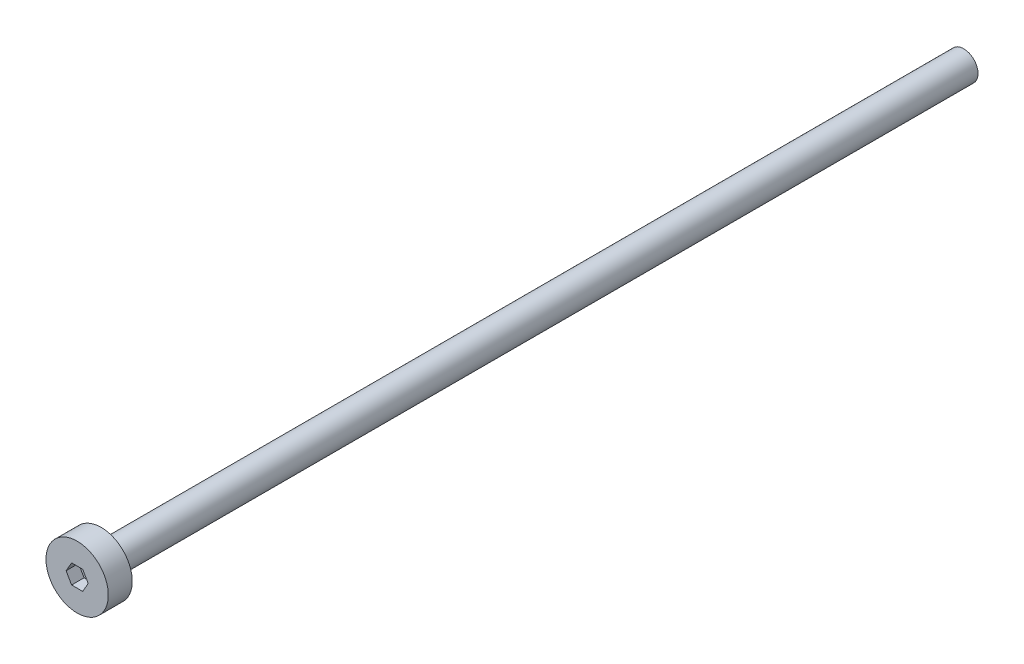
ISO-10303-21;
HEADER;
FILE_DESCRIPTION(('STEP AP214'),'2;1');
FILE_NAME('part.step','',(''),(''),'','','');
FILE_SCHEMA(('AUTOMOTIVE_DESIGN { 1 0 10303 214 1 1 1 1 }'));
ENDSEC;
DATA;
#1=APPLICATION_CONTEXT('core data for automotive mechanical design processes');
#2=APPLICATION_PROTOCOL_DEFINITION('international standard','automotive_design',2000,#1);
#3=PRODUCT_CONTEXT('',#1,'mechanical');
#4=PRODUCT('Part','Part','',(#3));
#5=PRODUCT_RELATED_PRODUCT_CATEGORY('part','',(#4));
#6=PRODUCT_DEFINITION_FORMATION('','',#4);
#7=PRODUCT_DEFINITION_CONTEXT('part definition',#1,'design');
#8=PRODUCT_DEFINITION('design','',#6,#7);
#9=PRODUCT_DEFINITION_SHAPE('','',#8);
#10=(LENGTH_UNIT() NAMED_UNIT(*) SI_UNIT(.MILLI.,.METRE.));
#11=(NAMED_UNIT(*) PLANE_ANGLE_UNIT() SI_UNIT($,.RADIAN.));
#12=(NAMED_UNIT(*) SI_UNIT($,.STERADIAN.) SOLID_ANGLE_UNIT());
#13=UNCERTAINTY_MEASURE_WITH_UNIT(LENGTH_MEASURE(1.E-05),#10,'distance_accuracy_value','');
#14=(GEOMETRIC_REPRESENTATION_CONTEXT(3) GLOBAL_UNCERTAINTY_ASSIGNED_CONTEXT((#13)) GLOBAL_UNIT_ASSIGNED_CONTEXT((#10,
#11,#12)) REPRESENTATION_CONTEXT('',''));
#15=CARTESIAN_POINT('',(0.,0.,0.));
#16=DIRECTION('',(0.,0.,1.));
#17=DIRECTION('',(1.,0.,0.));
#18=AXIS2_PLACEMENT_3D('',#15,#16,#17);
#19=CARTESIAN_POINT('',(0.,0.,1.2));
#20=DIRECTION('',(0.,0.,1.));
#21=DIRECTION('',(1.,0.,0.));
#22=AXIS2_PLACEMENT_3D('',#19,#20,#21);
#23=PLANE('',#22);
#24=DIRECTION('',(-0.50000000000019,0.866025403784329,0.));
#25=VECTOR('',#24,1.);
#26=CARTESIAN_POINT('',(1.154700538379,0.,1.2));
#27=LINE('',#26,#25);
#28=CARTESIAN_POINT('',(1.154700538379,0.,1.2));
#29=VERTEX_POINT('',#28);
#30=CARTESIAN_POINT('',(0.57735026919,1.,1.2));
#31=VERTEX_POINT('',#30);
#32=EDGE_CURVE('E9',#29,#31,#27,.T.);
#33=ORIENTED_EDGE('',*,*,#32,.T.);
#34=DIRECTION('',(-1.,0.,0.));
#35=VECTOR('',#34,1.);
#36=CARTESIAN_POINT('',(0.57735026919,1.,1.2));
#37=LINE('',#36,#35);
#38=CARTESIAN_POINT('',(-0.57735026919,1.,1.2));
#39=VERTEX_POINT('',#38);
#40=EDGE_CURVE('E158',#31,#39,#37,.T.);
#41=ORIENTED_EDGE('',*,*,#40,.T.);
#42=DIRECTION('',(-0.50000000000019,-0.866025403784329,0.));
#43=VECTOR('',#42,1.);
#44=CARTESIAN_POINT('',(-0.57735026919,1.,1.2));
#45=LINE('',#44,#43);
#46=CARTESIAN_POINT('',(-1.154700538379,0.,1.2));
#47=VERTEX_POINT('',#46);
#48=EDGE_CURVE('E86',#39,#47,#45,.T.);
#49=ORIENTED_EDGE('',*,*,#48,.T.);
#50=DIRECTION('',(0.50000000000019,-0.866025403784329,0.));
#51=VECTOR('',#50,1.);
#52=CARTESIAN_POINT('',(-1.154700538379,0.,1.2));
#53=LINE('',#52,#51);
#54=CARTESIAN_POINT('',(-0.57735026919,-1.,1.2));
#55=VERTEX_POINT('',#54);
#56=EDGE_CURVE('E94',#47,#55,#53,.T.);
#57=ORIENTED_EDGE('',*,*,#56,.T.);
#58=DIRECTION('',(1.,0.,0.));
#59=VECTOR('',#58,1.);
#60=CARTESIAN_POINT('',(-0.57735026919,-1.,1.2));
#61=LINE('',#60,#59);
#62=CARTESIAN_POINT('',(0.57735026919,-1.,1.2));
#63=VERTEX_POINT('',#62);
#64=EDGE_CURVE('E140',#55,#63,#61,.T.);
#65=ORIENTED_EDGE('',*,*,#64,.T.);
#66=DIRECTION('',(0.50000000000019,0.866025403784329,0.));
#67=VECTOR('',#66,1.);
#68=CARTESIAN_POINT('',(0.57735026919,-1.,1.2));
#69=LINE('',#68,#67);
#70=EDGE_CURVE('E110',#63,#29,#69,.T.);
#71=ORIENTED_EDGE('',*,*,#70,.T.);
#72=EDGE_LOOP('',(#33,#41,#49,#57,#65,#71));
#73=FACE_BOUND('',#72,.T.);
#74=ADVANCED_FACE('F14',(#73),#23,.T.);
#75=CARTESIAN_POINT('',(0.,0.,-90.));
#76=DIRECTION('',(0.,0.,-1.));
#77=DIRECTION('',(0.,-1.,0.));
#78=AXIS2_PLACEMENT_3D('',#75,#76,#77);
#79=PLANE('',#78);
#80=CARTESIAN_POINT('',(0.,0.,-90.));
#81=DIRECTION('',(0.,0.,-1.));
#82=DIRECTION('',(-1.,0.,0.));
#83=AXIS2_PLACEMENT_3D('',#80,#81,#82);
#84=CIRCLE('',#83,1.5);
#85=CARTESIAN_POINT('',(-1.5,0.,-90.));
#86=VERTEX_POINT('',#85);
#87=EDGE_CURVE('E106',#86,#86,#84,.T.);
#88=ORIENTED_EDGE('',*,*,#87,.T.);
#89=EDGE_LOOP('',(#88));
#90=FACE_BOUND('',#89,.T.);
#91=ADVANCED_FACE('F16',(#90),#79,.T.);
#92=CARTESIAN_POINT('',(1.154700538379,0.,1.2));
#93=DIRECTION('',(-0.866025403784329,-0.50000000000019,0.));
#94=DIRECTION('',(-0.50000000000019,0.866025403784329,0.));
#95=AXIS2_PLACEMENT_3D('',#92,#93,#94);
#96=PLANE('',#95);
#97=ORIENTED_EDGE('',*,*,#32,.F.);
#98=DIRECTION('',(0.,0.,1.));
#99=VECTOR('',#98,1.);
#100=CARTESIAN_POINT('',(1.154700538379,0.,1.2));
#101=LINE('',#100,#99);
#102=CARTESIAN_POINT('',(1.154700538379,0.,2.5));
#103=VERTEX_POINT('',#102);
#104=EDGE_CURVE('E137',#29,#103,#101,.T.);
#105=ORIENTED_EDGE('',*,*,#104,.T.);
#106=DIRECTION('',(-0.50000000000019,0.866025403784329,0.));
#107=VECTOR('',#106,1.);
#108=CARTESIAN_POINT('',(1.010362971082,0.25,2.5));
#109=LINE('',#108,#107);
#110=CARTESIAN_POINT('',(0.57735026919,1.,2.5));
#111=VERTEX_POINT('',#110);
#112=EDGE_CURVE('E121',#103,#111,#109,.T.);
#113=ORIENTED_EDGE('',*,*,#112,.T.);
#114=DIRECTION('',(0.,0.,1.));
#115=VECTOR('',#114,1.);
#116=CARTESIAN_POINT('',(0.57735026919,1.,1.2));
#117=LINE('',#116,#115);
#118=EDGE_CURVE('E25',#31,#111,#117,.T.);
#119=ORIENTED_EDGE('',*,*,#118,.F.);
#120=EDGE_LOOP('',(#97,#105,#113,#119));
#121=FACE_BOUND('',#120,.T.);
#122=ADVANCED_FACE('F211',(#121),#96,.T.);
#123=CARTESIAN_POINT('',(0.57735026919,1.,1.2));
#124=DIRECTION('',(0.,-1.,0.));
#125=DIRECTION('',(-1.,0.,0.));
#126=AXIS2_PLACEMENT_3D('',#123,#124,#125);
#127=PLANE('',#126);
#128=ORIENTED_EDGE('',*,*,#40,.F.);
#129=ORIENTED_EDGE('',*,*,#118,.T.);
#130=DIRECTION('',(-1.,0.,0.));
#131=VECTOR('',#130,1.);
#132=CARTESIAN_POINT('',(0.288675134595,1.,2.5));
#133=LINE('',#132,#131);
#134=CARTESIAN_POINT('',(-0.57735026919,1.,2.5));
#135=VERTEX_POINT('',#134);
#136=EDGE_CURVE('E125',#111,#135,#133,.T.);
#137=ORIENTED_EDGE('',*,*,#136,.T.);
#138=DIRECTION('',(0.,0.,1.));
#139=VECTOR('',#138,1.);
#140=CARTESIAN_POINT('',(-0.57735026919,1.,1.2));
#141=LINE('',#140,#139);
#142=EDGE_CURVE('E161',#39,#135,#141,.T.);
#143=ORIENTED_EDGE('',*,*,#142,.F.);
#144=EDGE_LOOP('',(#128,#129,#137,#143));
#145=FACE_BOUND('',#144,.T.);
#146=ADVANCED_FACE('F201',(#145),#127,.T.);
#147=CARTESIAN_POINT('',(-0.57735026919,1.,1.2));
#148=DIRECTION('',(0.866025403784329,-0.50000000000019,0.));
#149=DIRECTION('',(0.,0.,-1.));
#150=AXIS2_PLACEMENT_3D('',#147,#148,#149);
#151=PLANE('',#150);
#152=ORIENTED_EDGE('',*,*,#48,.F.);
#153=ORIENTED_EDGE('',*,*,#142,.T.);
#154=DIRECTION('',(-0.50000000000019,-0.866025403784329,0.));
#155=VECTOR('',#154,1.);
#156=CARTESIAN_POINT('',(-0.721687836487,0.75,2.5));
#157=LINE('',#156,#155);
#158=CARTESIAN_POINT('',(-1.154700538379,0.,2.5));
#159=VERTEX_POINT('',#158);
#160=EDGE_CURVE('E144',#135,#159,#157,.T.);
#161=ORIENTED_EDGE('',*,*,#160,.T.);
#162=DIRECTION('',(0.,0.,1.));
#163=VECTOR('',#162,1.);
#164=CARTESIAN_POINT('',(-1.154700538379,0.,1.2));
#165=LINE('',#164,#163);
#166=EDGE_CURVE('E141',#47,#159,#165,.T.);
#167=ORIENTED_EDGE('',*,*,#166,.F.);
#168=EDGE_LOOP('',(#152,#153,#161,#167));
#169=FACE_BOUND('',#168,.T.);
#170=ADVANCED_FACE('F197',(#169),#151,.T.);
#171=CARTESIAN_POINT('',(-1.154700538379,0.,1.2));
#172=DIRECTION('',(0.866025403784329,0.50000000000019,0.));
#173=DIRECTION('',(0.,0.,-1.));
#174=AXIS2_PLACEMENT_3D('',#171,#172,#173);
#175=PLANE('',#174);
#176=ORIENTED_EDGE('',*,*,#56,.F.);
#177=ORIENTED_EDGE('',*,*,#166,.T.);
#178=DIRECTION('',(0.50000000000019,-0.866025403784329,0.));
#179=VECTOR('',#178,1.);
#180=CARTESIAN_POINT('',(-1.010362971082,-0.25,2.5));
#181=LINE('',#180,#179);
#182=CARTESIAN_POINT('',(-0.57735026919,-1.,2.5));
#183=VERTEX_POINT('',#182);
#184=EDGE_CURVE('E148',#159,#183,#181,.T.);
#185=ORIENTED_EDGE('',*,*,#184,.T.);
#186=DIRECTION('',(0.,0.,1.));
#187=VECTOR('',#186,1.);
#188=CARTESIAN_POINT('',(-0.57735026919,-1.,1.2));
#189=LINE('',#188,#187);
#190=EDGE_CURVE('E18',#55,#183,#189,.T.);
#191=ORIENTED_EDGE('',*,*,#190,.F.);
#192=EDGE_LOOP('',(#176,#177,#185,#191));
#193=FACE_BOUND('',#192,.T.);
#194=ADVANCED_FACE('F193',(#193),#175,.T.);
#195=CARTESIAN_POINT('',(-0.57735026919,-1.,1.2));
#196=DIRECTION('',(0.,1.,0.));
#197=DIRECTION('',(1.,0.,0.));
#198=AXIS2_PLACEMENT_3D('',#195,#196,#197);
#199=PLANE('',#198);
#200=ORIENTED_EDGE('',*,*,#64,.F.);
#201=ORIENTED_EDGE('',*,*,#190,.T.);
#202=DIRECTION('',(1.,0.,0.));
#203=VECTOR('',#202,1.);
#204=CARTESIAN_POINT('',(-0.288675134595,-1.,2.5));
#205=LINE('',#204,#203);
#206=CARTESIAN_POINT('',(0.57735026919,-1.,2.5));
#207=VERTEX_POINT('',#206);
#208=EDGE_CURVE('E154',#183,#207,#205,.T.);
#209=ORIENTED_EDGE('',*,*,#208,.T.);
#210=DIRECTION('',(0.,0.,1.));
#211=VECTOR('',#210,1.);
#212=CARTESIAN_POINT('',(0.57735026919,-1.,1.2));
#213=LINE('',#212,#211);
#214=EDGE_CURVE('E132',#63,#207,#213,.T.);
#215=ORIENTED_EDGE('',*,*,#214,.F.);
#216=EDGE_LOOP('',(#200,#201,#209,#215));
#217=FACE_BOUND('',#216,.T.);
#218=ADVANCED_FACE('F191',(#217),#199,.T.);
#219=CARTESIAN_POINT('',(0.57735026919,-1.,1.2));
#220=DIRECTION('',(-0.866025403784329,0.50000000000019,0.));
#221=DIRECTION('',(0.,0.,1.));
#222=AXIS2_PLACEMENT_3D('',#219,#220,#221);
#223=PLANE('',#222);
#224=ORIENTED_EDGE('',*,*,#70,.F.);
#225=ORIENTED_EDGE('',*,*,#214,.T.);
#226=DIRECTION('',(0.50000000000019,0.866025403784329,0.));
#227=VECTOR('',#226,1.);
#228=CARTESIAN_POINT('',(0.721687836487,-0.75,2.5));
#229=LINE('',#228,#227);
#230=EDGE_CURVE('E114',#207,#103,#229,.T.);
#231=ORIENTED_EDGE('',*,*,#230,.T.);
#232=ORIENTED_EDGE('',*,*,#104,.F.);
#233=EDGE_LOOP('',(#224,#225,#231,#232));
#234=FACE_BOUND('',#233,.T.);
#235=ADVANCED_FACE('F179',(#234),#223,.T.);
#236=CARTESIAN_POINT('',(0.,0.,0.));
#237=DIRECTION('',(0.,0.,-1.));
#238=DIRECTION('',(-1.,0.,0.));
#239=AXIS2_PLACEMENT_3D('',#236,#237,#238);
#240=CYLINDRICAL_SURFACE('',#239,1.5);
#241=ORIENTED_EDGE('',*,*,#87,.F.);
#242=DIRECTION('',(0.,0.,-1.));
#243=VECTOR('',#242,1.);
#244=CARTESIAN_POINT('',(-1.5,0.,0.));
#245=LINE('',#244,#243);
#246=CARTESIAN_POINT('',(-1.5,0.,0.));
#247=VERTEX_POINT('',#246);
#248=EDGE_CURVE('E103',#247,#86,#245,.T.);
#249=ORIENTED_EDGE('',*,*,#248,.F.);
#250=CARTESIAN_POINT('',(0.,0.,0.));
#251=DIRECTION('',(0.,0.,-1.));
#252=DIRECTION('',(-1.,0.,0.));
#253=AXIS2_PLACEMENT_3D('',#250,#251,#252);
#254=CIRCLE('',#253,1.5);
#255=EDGE_CURVE('E108',#247,#247,#254,.T.);
#256=ORIENTED_EDGE('',*,*,#255,.T.);
#257=ORIENTED_EDGE('',*,*,#248,.T.);
#258=EDGE_LOOP('',(#241,#249,#256,#257));
#259=FACE_BOUND('',#258,.T.);
#260=ADVANCED_FACE('F105',(#259),#240,.T.);
#261=CARTESIAN_POINT('',(0.,0.,2.5));
#262=DIRECTION('',(0.,0.,-1.));
#263=DIRECTION('',(0.,-1.,0.));
#264=AXIS2_PLACEMENT_3D('',#261,#262,#263);
#265=PLANE('',#264);
#266=ORIENTED_EDGE('',*,*,#208,.F.);
#267=ORIENTED_EDGE('',*,*,#184,.F.);
#268=ORIENTED_EDGE('',*,*,#160,.F.);
#269=ORIENTED_EDGE('',*,*,#136,.F.);
#270=ORIENTED_EDGE('',*,*,#112,.F.);
#271=ORIENTED_EDGE('',*,*,#230,.F.);
#272=EDGE_LOOP('',(#266,#267,#268,#269,#270,#271));
#273=FACE_BOUND('',#272,.T.);
#274=CARTESIAN_POINT('',(0.,0.,2.5));
#275=DIRECTION('',(0.,0.,-1.));
#276=DIRECTION('',(-1.,0.,0.));
#277=AXIS2_PLACEMENT_3D('',#274,#275,#276);
#278=CIRCLE('',#277,3.25);
#279=CARTESIAN_POINT('',(-3.25,0.,2.5));
#280=VERTEX_POINT('',#279);
#281=EDGE_CURVE('E127',#280,#280,#278,.T.);
#282=ORIENTED_EDGE('',*,*,#281,.F.);
#283=EDGE_LOOP('',(#282));
#284=FACE_BOUND('',#283,.T.);
#285=ADVANCED_FACE('F186',(#273,#284),#265,.F.);
#286=CARTESIAN_POINT('',(0.,0.,0.));
#287=DIRECTION('',(0.,0.,-1.));
#288=DIRECTION('',(0.,-1.,0.));
#289=AXIS2_PLACEMENT_3D('',#286,#287,#288);
#290=PLANE('',#289);
#291=ORIENTED_EDGE('',*,*,#255,.F.);
#292=EDGE_LOOP('',(#291));
#293=FACE_BOUND('',#292,.T.);
#294=CARTESIAN_POINT('',(0.,0.,0.));
#295=DIRECTION('',(0.,0.,-1.));
#296=DIRECTION('',(-1.,0.,0.));
#297=AXIS2_PLACEMENT_3D('',#294,#295,#296);
#298=CIRCLE('',#297,3.25);
#299=CARTESIAN_POINT('',(-3.25,0.,0.));
#300=VERTEX_POINT('',#299);
#301=EDGE_CURVE('E136',#300,#300,#298,.T.);
#302=ORIENTED_EDGE('',*,*,#301,.T.);
#303=EDGE_LOOP('',(#302));
#304=FACE_BOUND('',#303,.T.);
#305=ADVANCED_FACE('F236',(#293,#304),#290,.T.);
#306=CARTESIAN_POINT('',(0.,0.,2.5));
#307=DIRECTION('',(0.,0.,-1.));
#308=DIRECTION('',(-1.,0.,0.));
#309=AXIS2_PLACEMENT_3D('',#306,#307,#308);
#310=CYLINDRICAL_SURFACE('',#309,3.25);
#311=ORIENTED_EDGE('',*,*,#301,.F.);
#312=DIRECTION('',(0.,0.,-1.));
#313=VECTOR('',#312,1.);
#314=CARTESIAN_POINT('',(-3.25,0.,2.5));
#315=LINE('',#314,#313);
#316=EDGE_CURVE('E129',#280,#300,#315,.T.);
#317=ORIENTED_EDGE('',*,*,#316,.F.);
#318=ORIENTED_EDGE('',*,*,#281,.T.);
#319=ORIENTED_EDGE('',*,*,#316,.T.);
#320=EDGE_LOOP('',(#311,#317,#318,#319));
#321=FACE_BOUND('',#320,.T.);
#322=ADVANCED_FACE('F238',(#321),#310,.T.);
#323=CLOSED_SHELL('',(#74,#91,#122,#146,#170,#194,#218,#235,#260,#285,#305,#322));
#324=MANIFOLD_SOLID_BREP('B1',#323);
#325=ADVANCED_BREP_SHAPE_REPRESENTATION('',(#18,#324),#14);
#326=SHAPE_DEFINITION_REPRESENTATION(#9,#325);
ENDSEC;
END-ISO-10303-21;
